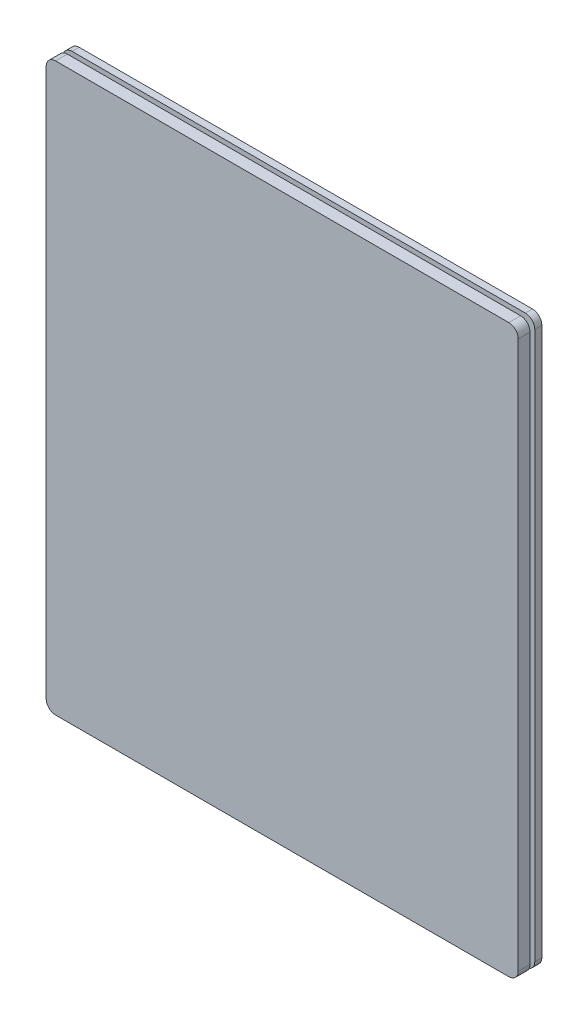
ISO-10303-21;
HEADER;
FILE_DESCRIPTION(('STEP AP214'),'2;1');
FILE_NAME('part.step','',(''),(''),'','','');
FILE_SCHEMA(('AUTOMOTIVE_DESIGN { 1 0 10303 214 1 1 1 1 }'));
ENDSEC;
DATA;
#1=APPLICATION_CONTEXT('core data for automotive mechanical design processes');
#2=APPLICATION_PROTOCOL_DEFINITION('international standard','automotive_design',2000,#1);
#3=PRODUCT_CONTEXT('',#1,'mechanical');
#4=PRODUCT('Part','Part','',(#3));
#5=PRODUCT_RELATED_PRODUCT_CATEGORY('part','',(#4));
#6=PRODUCT_DEFINITION_FORMATION('','',#4);
#7=PRODUCT_DEFINITION_CONTEXT('part definition',#1,'design');
#8=PRODUCT_DEFINITION('design','',#6,#7);
#9=PRODUCT_DEFINITION_SHAPE('','',#8);
#10=(LENGTH_UNIT() NAMED_UNIT(*) SI_UNIT(.MILLI.,.METRE.));
#11=(NAMED_UNIT(*) PLANE_ANGLE_UNIT() SI_UNIT($,.RADIAN.));
#12=(NAMED_UNIT(*) SI_UNIT($,.STERADIAN.) SOLID_ANGLE_UNIT());
#13=UNCERTAINTY_MEASURE_WITH_UNIT(LENGTH_MEASURE(1.E-05),#10,'distance_accuracy_value','');
#14=(GEOMETRIC_REPRESENTATION_CONTEXT(3) GLOBAL_UNCERTAINTY_ASSIGNED_CONTEXT((#13)) GLOBAL_UNIT_ASSIGNED_CONTEXT((#10,
#11,#12)) REPRESENTATION_CONTEXT('',''));
#15=CARTESIAN_POINT('',(0.,0.,0.));
#16=DIRECTION('',(0.,0.,1.));
#17=DIRECTION('',(1.,0.,0.));
#18=AXIS2_PLACEMENT_3D('',#15,#16,#17);
#19=CARTESIAN_POINT('',(-5.08133971291867,6.80382775119617,0.6));
#20=DIRECTION('',(1.,0.,0.));
#21=DIRECTION('',(0.,1.,0.));
#22=AXIS2_PLACEMENT_3D('',#19,#20,#21);
#23=PLANE('',#22);
#24=DIRECTION('',(0.,1.,0.));
#25=VECTOR('',#24,1.);
#26=CARTESIAN_POINT('',(-5.08133971291866,6.80382775119617,0.1));
#27=LINE('',#26,#25);
#28=CARTESIAN_POINT('',(-5.08133971291866,-4.99617224880383,0.1));
#29=VERTEX_POINT('',#28);
#30=CARTESIAN_POINT('',(-5.08133971291866,6.60382775119617,0.1));
#31=VERTEX_POINT('',#30);
#32=EDGE_CURVE('E358',#29,#31,#27,.T.);
#33=ORIENTED_EDGE('',*,*,#32,.F.);
#34=DIRECTION('',(0.,0.,-1.));
#35=VECTOR('',#34,1.);
#36=CARTESIAN_POINT('',(-5.08133971291866,-4.99617224880383,0.6));
#37=LINE('',#36,#35);
#38=CARTESIAN_POINT('',(-5.08133971291867,-4.99617224880383,0.25));
#39=VERTEX_POINT('',#38);
#40=EDGE_CURVE('E390',#29,#39,#37,.F.);
#41=ORIENTED_EDGE('',*,*,#40,.T.);
#42=DIRECTION('',(0.,-1.,0.));
#43=VECTOR('',#42,1.);
#44=CARTESIAN_POINT('',(-5.08133971291867,6.80382775119617,0.25));
#45=LINE('',#44,#43);
#46=CARTESIAN_POINT('',(-5.08133971291867,6.60382775119617,0.25));
#47=VERTEX_POINT('',#46);
#48=EDGE_CURVE('E265',#47,#39,#45,.T.);
#49=ORIENTED_EDGE('',*,*,#48,.F.);
#50=DIRECTION('',(0.,0.,-1.));
#51=VECTOR('',#50,1.);
#52=CARTESIAN_POINT('',(-5.08133971291867,6.60382775119617,0.6));
#53=LINE('',#52,#51);
#54=EDGE_CURVE('E387',#47,#31,#53,.T.);
#55=ORIENTED_EDGE('',*,*,#54,.T.);
#56=EDGE_LOOP('',(#33,#41,#49,#55));
#57=FACE_BOUND('',#56,.T.);
#58=ADVANCED_FACE('F34',(#57),#23,.F.);
#59=CARTESIAN_POINT('',(-5.08133971291866,-5.19617224880383,0.6));
#60=DIRECTION('',(0.,1.,0.));
#61=DIRECTION('',(0.,0.,1.));
#62=AXIS2_PLACEMENT_3D('',#59,#60,#61);
#63=PLANE('',#62);
#64=DIRECTION('',(1.,0.,0.));
#65=VECTOR('',#64,1.);
#66=CARTESIAN_POINT('',(-5.08133971291867,-5.19617224880383,0.25));
#67=LINE('',#66,#65);
#68=CARTESIAN_POINT('',(-4.88133971291866,-5.19617224880383,0.25));
#69=VERTEX_POINT('',#68);
#70=CARTESIAN_POINT('',(4.71866028708134,-5.19617224880383,0.25));
#71=VERTEX_POINT('',#70);
#72=EDGE_CURVE('E268',#69,#71,#67,.T.);
#73=ORIENTED_EDGE('',*,*,#72,.F.);
#74=DIRECTION('',(0.,0.,-1.));
#75=VECTOR('',#74,1.);
#76=CARTESIAN_POINT('',(-4.88133971291866,-5.19617224880383,0.6));
#77=LINE('',#76,#75);
#78=CARTESIAN_POINT('',(-4.88133971291866,-5.19617224880383,0.1));
#79=VERTEX_POINT('',#78);
#80=EDGE_CURVE('E376',#69,#79,#77,.T.);
#81=ORIENTED_EDGE('',*,*,#80,.T.);
#82=DIRECTION('',(-1.,0.,0.));
#83=VECTOR('',#82,1.);
#84=CARTESIAN_POINT('',(4.91866028708133,-5.19617224880383,0.1));
#85=LINE('',#84,#83);
#86=CARTESIAN_POINT('',(4.71866028708134,-5.19617224880383,0.1));
#87=VERTEX_POINT('',#86);
#88=EDGE_CURVE('E355',#87,#79,#85,.T.);
#89=ORIENTED_EDGE('',*,*,#88,.F.);
#90=DIRECTION('',(0.,0.,-1.));
#91=VECTOR('',#90,1.);
#92=CARTESIAN_POINT('',(4.71866028708134,-5.19617224880383,0.6));
#93=LINE('',#92,#91);
#94=EDGE_CURVE('E374',#87,#71,#93,.F.);
#95=ORIENTED_EDGE('',*,*,#94,.T.);
#96=EDGE_LOOP('',(#73,#81,#89,#95));
#97=FACE_BOUND('',#96,.T.);
#98=ADVANCED_FACE('F461',(#97),#63,.F.);
#99=CARTESIAN_POINT('',(4.91866028708133,6.80382775119617,0.6));
#100=DIRECTION('',(-1.,0.,0.));
#101=DIRECTION('',(0.,-1.,0.));
#102=AXIS2_PLACEMENT_3D('',#99,#100,#101);
#103=PLANE('',#102);
#104=DIRECTION('',(0.,1.,0.));
#105=VECTOR('',#104,1.);
#106=CARTESIAN_POINT('',(4.91866028708134,6.80382775119617,0.25));
#107=LINE('',#106,#105);
#108=CARTESIAN_POINT('',(4.91866028708134,-4.99617224880383,0.25));
#109=VERTEX_POINT('',#108);
#110=CARTESIAN_POINT('',(4.91866028708134,6.60382775119617,0.25));
#111=VERTEX_POINT('',#110);
#112=EDGE_CURVE('E272',#109,#111,#107,.T.);
#113=ORIENTED_EDGE('',*,*,#112,.F.);
#114=DIRECTION('',(0.,0.,-1.));
#115=VECTOR('',#114,1.);
#116=CARTESIAN_POINT('',(4.91866028708134,-4.99617224880383,0.6));
#117=LINE('',#116,#115);
#118=CARTESIAN_POINT('',(4.91866028708133,-4.99617224880383,0.1));
#119=VERTEX_POINT('',#118);
#120=EDGE_CURVE('E427',#109,#119,#117,.T.);
#121=ORIENTED_EDGE('',*,*,#120,.T.);
#122=DIRECTION('',(0.,-1.,0.));
#123=VECTOR('',#122,1.);
#124=CARTESIAN_POINT('',(4.91866028708133,6.80382775119617,0.1));
#125=LINE('',#124,#123);
#126=CARTESIAN_POINT('',(4.91866028708133,6.60382775119617,0.1));
#127=VERTEX_POINT('',#126);
#128=EDGE_CURVE('E338',#127,#119,#125,.T.);
#129=ORIENTED_EDGE('',*,*,#128,.F.);
#130=DIRECTION('',(0.,0.,-1.));
#131=VECTOR('',#130,1.);
#132=CARTESIAN_POINT('',(4.91866028708133,6.60382775119617,0.6));
#133=LINE('',#132,#131);
#134=EDGE_CURVE('E425',#127,#111,#133,.F.);
#135=ORIENTED_EDGE('',*,*,#134,.T.);
#136=EDGE_LOOP('',(#113,#121,#129,#135));
#137=FACE_BOUND('',#136,.T.);
#138=ADVANCED_FACE('F470',(#137),#103,.F.);
#139=CARTESIAN_POINT('',(-5.08133971291867,6.80382775119617,0.6));
#140=DIRECTION('',(0.,-1.,0.));
#141=DIRECTION('',(0.,0.,-1.));
#142=AXIS2_PLACEMENT_3D('',#139,#140,#141);
#143=PLANE('',#142);
#144=DIRECTION('',(-1.,0.,0.));
#145=VECTOR('',#144,1.);
#146=CARTESIAN_POINT('',(-5.08133971291867,6.80382775119617,0.25));
#147=LINE('',#146,#145);
#148=CARTESIAN_POINT('',(4.71866028708133,6.80382775119617,0.25));
#149=VERTEX_POINT('',#148);
#150=CARTESIAN_POINT('',(-4.88133971291867,6.80382775119617,0.25));
#151=VERTEX_POINT('',#150);
#152=EDGE_CURVE('E275',#149,#151,#147,.T.);
#153=ORIENTED_EDGE('',*,*,#152,.F.);
#154=DIRECTION('',(0.,0.,-1.));
#155=VECTOR('',#154,1.);
#156=CARTESIAN_POINT('',(4.71866028708133,6.80382775119617,0.6));
#157=LINE('',#156,#155);
#158=CARTESIAN_POINT('',(4.71866028708133,6.80382775119617,0.1));
#159=VERTEX_POINT('',#158);
#160=EDGE_CURVE('E11',#149,#159,#157,.T.);
#161=ORIENTED_EDGE('',*,*,#160,.T.);
#162=DIRECTION('',(1.,0.,0.));
#163=VECTOR('',#162,1.);
#164=CARTESIAN_POINT('',(4.91866028708133,6.80382775119617,0.1));
#165=LINE('',#164,#163);
#166=CARTESIAN_POINT('',(-4.88133971291867,6.80382775119617,0.1));
#167=VERTEX_POINT('',#166);
#168=EDGE_CURVE('E361',#167,#159,#165,.T.);
#169=ORIENTED_EDGE('',*,*,#168,.F.);
#170=DIRECTION('',(0.,0.,-1.));
#171=VECTOR('',#170,1.);
#172=CARTESIAN_POINT('',(-4.88133971291867,6.80382775119617,0.6));
#173=LINE('',#172,#171);
#174=EDGE_CURVE('E42',#167,#151,#173,.F.);
#175=ORIENTED_EDGE('',*,*,#174,.T.);
#176=EDGE_LOOP('',(#153,#161,#169,#175));
#177=FACE_BOUND('',#176,.T.);
#178=ADVANCED_FACE('F442',(#177),#143,.F.);
#179=CARTESIAN_POINT('',(0.,0.,0.1));
#180=DIRECTION('',(0.,0.,-1.));
#181=DIRECTION('',(-1.,0.,0.));
#182=AXIS2_PLACEMENT_3D('',#179,#180,#181);
#183=PLANE('',#182);
#184=DIRECTION('',(0.,1.,0.));
#185=VECTOR('',#184,1.);
#186=CARTESIAN_POINT('',(-3.88404126563209,4.78892639990253,0.1));
#187=LINE('',#186,#185);
#188=CARTESIAN_POINT('',(-3.88404126563209,-3.11592863377221,0.1));
#189=VERTEX_POINT('',#188);
#190=CARTESIAN_POINT('',(-3.88404126563209,4.78892639990253,0.1));
#191=VERTEX_POINT('',#190);
#192=EDGE_CURVE('E310',#189,#191,#187,.T.);
#193=ORIENTED_EDGE('',*,*,#192,.F.);
#194=CARTESIAN_POINT('',(-2.88404126563209,-3.11592863377222,0.1));
#195=DIRECTION('',(0.,0.,-1.));
#196=DIRECTION('',(-1.,0.,0.));
#197=AXIS2_PLACEMENT_3D('',#194,#195,#196);
#198=CIRCLE('',#197,1.);
#199=CARTESIAN_POINT('',(-2.88404126563208,-4.11592863377222,0.1));
#200=VERTEX_POINT('',#199);
#201=EDGE_CURVE('E307',#200,#189,#198,.T.);
#202=ORIENTED_EDGE('',*,*,#201,.F.);
#203=DIRECTION('',(-1.,0.,0.));
#204=VECTOR('',#203,1.);
#205=CARTESIAN_POINT('',(2.71255189932541,-4.11592863377222,0.1));
#206=LINE('',#205,#204);
#207=CARTESIAN_POINT('',(2.71255189932541,-4.11592863377222,0.1));
#208=VERTEX_POINT('',#207);
#209=EDGE_CURVE('E304',#208,#200,#206,.T.);
#210=ORIENTED_EDGE('',*,*,#209,.F.);
#211=CARTESIAN_POINT('',(2.71255189932542,-3.11592863377222,0.1));
#212=DIRECTION('',(0.,0.,-1.));
#213=DIRECTION('',(1.,0.,0.));
#214=AXIS2_PLACEMENT_3D('',#211,#212,#213);
#215=CIRCLE('',#214,1.);
#216=CARTESIAN_POINT('',(3.71255189932542,-3.11592863377222,0.1));
#217=VERTEX_POINT('',#216);
#218=EDGE_CURVE('E301',#217,#208,#215,.T.);
#219=ORIENTED_EDGE('',*,*,#218,.F.);
#220=DIRECTION('',(0.,-1.,0.));
#221=VECTOR('',#220,1.);
#222=CARTESIAN_POINT('',(3.71255189932542,4.78892639990253,0.1));
#223=LINE('',#222,#221);
#224=CARTESIAN_POINT('',(3.71255189932542,4.78892639990253,0.1));
#225=VERTEX_POINT('',#224);
#226=EDGE_CURVE('E298',#225,#217,#223,.T.);
#227=ORIENTED_EDGE('',*,*,#226,.F.);
#228=CARTESIAN_POINT('',(2.71255189932542,4.78892639990254,0.1));
#229=DIRECTION('',(0.,0.,-1.));
#230=DIRECTION('',(-1.,0.,0.));
#231=AXIS2_PLACEMENT_3D('',#228,#229,#230);
#232=CIRCLE('',#231,1.);
#233=CARTESIAN_POINT('',(2.71255189932541,5.78892639990254,0.1));
#234=VERTEX_POINT('',#233);
#235=EDGE_CURVE('E295',#234,#225,#232,.T.);
#236=ORIENTED_EDGE('',*,*,#235,.F.);
#237=DIRECTION('',(1.,0.,0.));
#238=VECTOR('',#237,1.);
#239=CARTESIAN_POINT('',(2.71255189932541,5.78892639990254,0.1));
#240=LINE('',#239,#238);
#241=CARTESIAN_POINT('',(-2.88404126563208,5.78892639990254,0.1));
#242=VERTEX_POINT('',#241);
#243=EDGE_CURVE('E291',#242,#234,#240,.T.);
#244=ORIENTED_EDGE('',*,*,#243,.F.);
#245=CARTESIAN_POINT('',(-2.88404126563209,4.78892639990254,0.1));
#246=DIRECTION('',(0.,0.,-1.));
#247=DIRECTION('',(-1.,0.,0.));
#248=AXIS2_PLACEMENT_3D('',#245,#246,#247);
#249=CIRCLE('',#248,1.);
#250=EDGE_CURVE('E288',#191,#242,#249,.T.);
#251=ORIENTED_EDGE('',*,*,#250,.F.);
#252=EDGE_LOOP('',(#193,#202,#210,#219,#227,#236,#244,#251));
#253=FACE_BOUND('',#252,.T.);
#254=ORIENTED_EDGE('',*,*,#88,.T.);
#255=CARTESIAN_POINT('',(-4.88133971291866,-4.99617224880383,0.1));
#256=DIRECTION('',(0.,0.,-1.));
#257=DIRECTION('',(-1.,0.,0.));
#258=AXIS2_PLACEMENT_3D('',#255,#256,#257);
#259=CIRCLE('',#258,0.2);
#260=EDGE_CURVE('E385',#79,#29,#259,.T.);
#261=ORIENTED_EDGE('',*,*,#260,.T.);
#262=ORIENTED_EDGE('',*,*,#32,.T.);
#263=CARTESIAN_POINT('',(-4.88133971291867,6.60382775119617,0.1));
#264=DIRECTION('',(0.,0.,-1.));
#265=DIRECTION('',(-1.,0.,0.));
#266=AXIS2_PLACEMENT_3D('',#263,#264,#265);
#267=CIRCLE('',#266,0.2);
#268=EDGE_CURVE('E379',#31,#167,#267,.T.);
#269=ORIENTED_EDGE('',*,*,#268,.T.);
#270=ORIENTED_EDGE('',*,*,#168,.T.);
#271=CARTESIAN_POINT('',(4.71866028708133,6.60382775119617,0.1));
#272=DIRECTION('',(0.,0.,-1.));
#273=DIRECTION('',(-1.,0.,0.));
#274=AXIS2_PLACEMENT_3D('',#271,#272,#273);
#275=CIRCLE('',#274,0.2);
#276=EDGE_CURVE('E381',#159,#127,#275,.T.);
#277=ORIENTED_EDGE('',*,*,#276,.T.);
#278=ORIENTED_EDGE('',*,*,#128,.T.);
#279=CARTESIAN_POINT('',(4.71866028708134,-4.99617224880383,0.1));
#280=DIRECTION('',(0.,0.,-1.));
#281=DIRECTION('',(-1.,0.,0.));
#282=AXIS2_PLACEMENT_3D('',#279,#280,#281);
#283=CIRCLE('',#282,0.2);
#284=EDGE_CURVE('E383',#119,#87,#283,.T.);
#285=ORIENTED_EDGE('',*,*,#284,.T.);
#286=EDGE_LOOP('',(#254,#261,#262,#269,#270,#277,#278,#285));
#287=FACE_BOUND('',#286,.T.);
#288=ADVANCED_FACE('F453',(#253,#287),#183,.T.);
#289=CARTESIAN_POINT('',(-2.88404126563209,4.78892639990254,0.1));
#290=DIRECTION('',(0.,0.,-1.));
#291=DIRECTION('',(-1.,0.,0.));
#292=AXIS2_PLACEMENT_3D('',#289,#290,#291);
#293=CYLINDRICAL_SURFACE('',#292,1.);
#294=CARTESIAN_POINT('',(-2.88404126563209,4.78892639990254,0.));
#295=DIRECTION('',(0.,0.,-1.));
#296=DIRECTION('',(-1.,0.,0.));
#297=AXIS2_PLACEMENT_3D('',#294,#295,#296);
#298=CIRCLE('',#297,1.);
#299=CARTESIAN_POINT('',(-3.88404126563209,4.78892639990253,0.));
#300=VERTEX_POINT('',#299);
#301=CARTESIAN_POINT('',(-2.88404126563208,5.78892639990254,0.));
#302=VERTEX_POINT('',#301);
#303=EDGE_CURVE('E278',#300,#302,#298,.T.);
#304=ORIENTED_EDGE('',*,*,#303,.F.);
#305=DIRECTION('',(0.,0.,-1.));
#306=VECTOR('',#305,1.);
#307=CARTESIAN_POINT('',(-3.88404126563209,4.78892639990253,0.1));
#308=LINE('',#307,#306);
#309=EDGE_CURVE('E336',#191,#300,#308,.T.);
#310=ORIENTED_EDGE('',*,*,#309,.F.);
#311=ORIENTED_EDGE('',*,*,#250,.T.);
#312=DIRECTION('',(0.,0.,-1.));
#313=VECTOR('',#312,1.);
#314=CARTESIAN_POINT('',(-2.88404126563208,5.78892639990254,0.1));
#315=LINE('',#314,#313);
#316=EDGE_CURVE('E313',#242,#302,#315,.T.);
#317=ORIENTED_EDGE('',*,*,#316,.T.);
#318=EDGE_LOOP('',(#304,#310,#311,#317));
#319=FACE_BOUND('',#318,.T.);
#320=ADVANCED_FACE('F544',(#319),#293,.T.);
#321=CARTESIAN_POINT('',(-3.88404126563209,4.78892639990253,0.1));
#322=DIRECTION('',(-1.,0.,0.));
#323=DIRECTION('',(0.,0.,1.));
#324=AXIS2_PLACEMENT_3D('',#321,#322,#323);
#325=PLANE('',#324);
#326=DIRECTION('',(0.,1.,0.));
#327=VECTOR('',#326,1.);
#328=CARTESIAN_POINT('',(-3.88404126563209,4.78892639990253,0.));
#329=LINE('',#328,#327);
#330=CARTESIAN_POINT('',(-3.88404126563209,-3.11592863377221,0.));
#331=VERTEX_POINT('',#330);
#332=EDGE_CURVE('E292',#331,#300,#329,.T.);
#333=ORIENTED_EDGE('',*,*,#332,.F.);
#334=DIRECTION('',(0.,0.,-1.));
#335=VECTOR('',#334,1.);
#336=CARTESIAN_POINT('',(-3.88404126563209,-3.11592863377221,0.1));
#337=LINE('',#336,#335);
#338=EDGE_CURVE('E339',#189,#331,#337,.T.);
#339=ORIENTED_EDGE('',*,*,#338,.F.);
#340=ORIENTED_EDGE('',*,*,#192,.T.);
#341=ORIENTED_EDGE('',*,*,#309,.T.);
#342=EDGE_LOOP('',(#333,#339,#340,#341));
#343=FACE_BOUND('',#342,.T.);
#344=ADVANCED_FACE('F540',(#343),#325,.T.);
#345=CARTESIAN_POINT('',(-2.88404126563209,-3.11592863377222,0.1));
#346=DIRECTION('',(0.,0.,-1.));
#347=DIRECTION('',(-1.,0.,0.));
#348=AXIS2_PLACEMENT_3D('',#345,#346,#347);
#349=CYLINDRICAL_SURFACE('',#348,1.);
#350=CARTESIAN_POINT('',(-2.88404126563209,-3.11592863377222,0.));
#351=DIRECTION('',(0.,0.,-1.));
#352=DIRECTION('',(-1.,0.,0.));
#353=AXIS2_PLACEMENT_3D('',#350,#351,#352);
#354=CIRCLE('',#353,1.);
#355=CARTESIAN_POINT('',(-2.88404126563208,-4.11592863377222,0.));
#356=VERTEX_POINT('',#355);
#357=EDGE_CURVE('E331',#356,#331,#354,.T.);
#358=ORIENTED_EDGE('',*,*,#357,.F.);
#359=DIRECTION('',(0.,0.,-1.));
#360=VECTOR('',#359,1.);
#361=CARTESIAN_POINT('',(-2.88404126563208,-4.11592863377222,0.1));
#362=LINE('',#361,#360);
#363=EDGE_CURVE('E341',#200,#356,#362,.T.);
#364=ORIENTED_EDGE('',*,*,#363,.F.);
#365=ORIENTED_EDGE('',*,*,#201,.T.);
#366=ORIENTED_EDGE('',*,*,#338,.T.);
#367=EDGE_LOOP('',(#358,#364,#365,#366));
#368=FACE_BOUND('',#367,.T.);
#369=ADVANCED_FACE('F543',(#368),#349,.T.);
#370=CARTESIAN_POINT('',(2.71255189932541,-4.11592863377222,0.1));
#371=DIRECTION('',(0.,-1.,0.));
#372=DIRECTION('',(0.,0.,-1.));
#373=AXIS2_PLACEMENT_3D('',#370,#371,#372);
#374=PLANE('',#373);
#375=DIRECTION('',(-1.,0.,0.));
#376=VECTOR('',#375,1.);
#377=CARTESIAN_POINT('',(2.71255189932541,-4.11592863377222,0.));
#378=LINE('',#377,#376);
#379=CARTESIAN_POINT('',(2.71255189932541,-4.11592863377222,0.));
#380=VERTEX_POINT('',#379);
#381=EDGE_CURVE('E328',#380,#356,#378,.T.);
#382=ORIENTED_EDGE('',*,*,#381,.F.);
#383=DIRECTION('',(0.,0.,-1.));
#384=VECTOR('',#383,1.);
#385=CARTESIAN_POINT('',(2.71255189932541,-4.11592863377222,0.1));
#386=LINE('',#385,#384);
#387=EDGE_CURVE('E343',#208,#380,#386,.T.);
#388=ORIENTED_EDGE('',*,*,#387,.F.);
#389=ORIENTED_EDGE('',*,*,#209,.T.);
#390=ORIENTED_EDGE('',*,*,#363,.T.);
#391=EDGE_LOOP('',(#382,#388,#389,#390));
#392=FACE_BOUND('',#391,.T.);
#393=ADVANCED_FACE('F548',(#392),#374,.T.);
#394=CARTESIAN_POINT('',(2.71255189932542,-3.11592863377222,0.1));
#395=DIRECTION('',(0.,0.,-1.));
#396=DIRECTION('',(-1.,0.,0.));
#397=AXIS2_PLACEMENT_3D('',#394,#395,#396);
#398=CYLINDRICAL_SURFACE('',#397,1.);
#399=CARTESIAN_POINT('',(2.71255189932542,-3.11592863377222,0.));
#400=DIRECTION('',(0.,0.,-1.));
#401=DIRECTION('',(1.,0.,0.));
#402=AXIS2_PLACEMENT_3D('',#399,#400,#401);
#403=CIRCLE('',#402,1.);
#404=CARTESIAN_POINT('',(3.71255189932542,-3.11592863377222,0.));
#405=VERTEX_POINT('',#404);
#406=EDGE_CURVE('E325',#405,#380,#403,.T.);
#407=ORIENTED_EDGE('',*,*,#406,.F.);
#408=DIRECTION('',(0.,0.,-1.));
#409=VECTOR('',#408,1.);
#410=CARTESIAN_POINT('',(3.71255189932542,-3.11592863377222,0.1));
#411=LINE('',#410,#409);
#412=EDGE_CURVE('E345',#217,#405,#411,.T.);
#413=ORIENTED_EDGE('',*,*,#412,.F.);
#414=ORIENTED_EDGE('',*,*,#218,.T.);
#415=ORIENTED_EDGE('',*,*,#387,.T.);
#416=EDGE_LOOP('',(#407,#413,#414,#415));
#417=FACE_BOUND('',#416,.T.);
#418=ADVANCED_FACE('F552',(#417),#398,.T.);
#419=CARTESIAN_POINT('',(3.71255189932542,4.78892639990253,0.1));
#420=DIRECTION('',(1.,0.,0.));
#421=DIRECTION('',(0.,0.,-1.));
#422=AXIS2_PLACEMENT_3D('',#419,#420,#421);
#423=PLANE('',#422);
#424=DIRECTION('',(0.,-1.,0.));
#425=VECTOR('',#424,1.);
#426=CARTESIAN_POINT('',(3.71255189932542,4.78892639990253,0.));
#427=LINE('',#426,#425);
#428=CARTESIAN_POINT('',(3.71255189932542,4.78892639990253,0.));
#429=VERTEX_POINT('',#428);
#430=EDGE_CURVE('E322',#429,#405,#427,.T.);
#431=ORIENTED_EDGE('',*,*,#430,.F.);
#432=DIRECTION('',(0.,0.,-1.));
#433=VECTOR('',#432,1.);
#434=CARTESIAN_POINT('',(3.71255189932542,4.78892639990253,0.1));
#435=LINE('',#434,#433);
#436=EDGE_CURVE('E347',#225,#429,#435,.T.);
#437=ORIENTED_EDGE('',*,*,#436,.F.);
#438=ORIENTED_EDGE('',*,*,#226,.T.);
#439=ORIENTED_EDGE('',*,*,#412,.T.);
#440=EDGE_LOOP('',(#431,#437,#438,#439));
#441=FACE_BOUND('',#440,.T.);
#442=ADVANCED_FACE('F556',(#441),#423,.T.);
#443=CARTESIAN_POINT('',(2.71255189932542,4.78892639990254,0.1));
#444=DIRECTION('',(0.,0.,-1.));
#445=DIRECTION('',(-1.,0.,0.));
#446=AXIS2_PLACEMENT_3D('',#443,#444,#445);
#447=CYLINDRICAL_SURFACE('',#446,1.);
#448=CARTESIAN_POINT('',(2.71255189932542,4.78892639990254,0.));
#449=DIRECTION('',(0.,0.,-1.));
#450=DIRECTION('',(-1.,0.,0.));
#451=AXIS2_PLACEMENT_3D('',#448,#449,#450);
#452=CIRCLE('',#451,1.);
#453=CARTESIAN_POINT('',(2.71255189932541,5.78892639990254,0.));
#454=VERTEX_POINT('',#453);
#455=EDGE_CURVE('E319',#454,#429,#452,.T.);
#456=ORIENTED_EDGE('',*,*,#455,.F.);
#457=DIRECTION('',(0.,0.,-1.));
#458=VECTOR('',#457,1.);
#459=CARTESIAN_POINT('',(2.71255189932541,5.78892639990254,0.1));
#460=LINE('',#459,#458);
#461=EDGE_CURVE('E349',#234,#454,#460,.T.);
#462=ORIENTED_EDGE('',*,*,#461,.F.);
#463=ORIENTED_EDGE('',*,*,#235,.T.);
#464=ORIENTED_EDGE('',*,*,#436,.T.);
#465=EDGE_LOOP('',(#456,#462,#463,#464));
#466=FACE_BOUND('',#465,.T.);
#467=ADVANCED_FACE('F560',(#466),#447,.T.);
#468=CARTESIAN_POINT('',(2.71255189932541,5.78892639990254,0.1));
#469=DIRECTION('',(0.,1.,0.));
#470=DIRECTION('',(0.,0.,1.));
#471=AXIS2_PLACEMENT_3D('',#468,#469,#470);
#472=PLANE('',#471);
#473=DIRECTION('',(1.,0.,0.));
#474=VECTOR('',#473,1.);
#475=CARTESIAN_POINT('',(2.71255189932541,5.78892639990254,0.));
#476=LINE('',#475,#474);
#477=EDGE_CURVE('E316',#302,#454,#476,.T.);
#478=ORIENTED_EDGE('',*,*,#477,.F.);
#479=ORIENTED_EDGE('',*,*,#316,.F.);
#480=ORIENTED_EDGE('',*,*,#243,.T.);
#481=ORIENTED_EDGE('',*,*,#461,.T.);
#482=EDGE_LOOP('',(#478,#479,#480,#481));
#483=FACE_BOUND('',#482,.T.);
#484=ADVANCED_FACE('F564',(#483),#472,.T.);
#485=CARTESIAN_POINT('',(0.,0.,0.));
#486=DIRECTION('',(0.,0.,1.));
#487=DIRECTION('',(1.,0.,0.));
#488=AXIS2_PLACEMENT_3D('',#485,#486,#487);
#489=PLANE('',#488);
#490=ORIENTED_EDGE('',*,*,#303,.T.);
#491=ORIENTED_EDGE('',*,*,#477,.T.);
#492=ORIENTED_EDGE('',*,*,#455,.T.);
#493=ORIENTED_EDGE('',*,*,#430,.T.);
#494=ORIENTED_EDGE('',*,*,#406,.T.);
#495=ORIENTED_EDGE('',*,*,#381,.T.);
#496=ORIENTED_EDGE('',*,*,#357,.T.);
#497=ORIENTED_EDGE('',*,*,#332,.T.);
#498=EDGE_LOOP('',(#490,#491,#492,#493,#494,#495,#496,#497));
#499=FACE_BOUND('',#498,.T.);
#500=ADVANCED_FACE('F537',(#499),#489,.F.);
#501=CARTESIAN_POINT('',(0.,0.,0.25));
#502=DIRECTION('',(0.,0.,1.));
#503=DIRECTION('',(1.,0.,0.));
#504=AXIS2_PLACEMENT_3D('',#501,#502,#503);
#505=PLANE('',#504);
#506=DIRECTION('',(0.646267289690569,0.763111125771343,0.));
#507=VECTOR('',#506,1.);
#508=CARTESIAN_POINT('',(0.,-0.374397757809675,0.25));
#509=LINE('',#508,#507);
#510=CARTESIAN_POINT('',(0.,-0.374397757809675,0.25));
#511=VERTEX_POINT('',#510);
#512=CARTESIAN_POINT('',(0.997821392762209,0.80382775119617,0.25));
#513=VERTEX_POINT('',#512);
#514=EDGE_CURVE('E232',#511,#513,#509,.T.);
#515=ORIENTED_EDGE('',*,*,#514,.F.);
#516=DIRECTION('',(0.610983232927453,-0.791643536625872,0.));
#517=VECTOR('',#516,1.);
#518=CARTESIAN_POINT('',(-0.9093436594938,0.80382775119617,0.25));
#519=LINE('',#518,#517);
#520=CARTESIAN_POINT('',(-0.9093436594938,0.80382775119617,0.25));
#521=VERTEX_POINT('',#520);
#522=EDGE_CURVE('E242',#521,#511,#519,.T.);
#523=ORIENTED_EDGE('',*,*,#522,.F.);
#524=DIRECTION('',(-0.646267289690569,-0.763111125771343,0.));
#525=VECTOR('',#524,1.);
#526=CARTESIAN_POINT('',(0.,1.87757892935281,0.25));
#527=LINE('',#526,#525);
#528=CARTESIAN_POINT('',(0.,1.87757892935281,0.25));
#529=VERTEX_POINT('',#528);
#530=EDGE_CURVE('E225',#529,#521,#527,.T.);
#531=ORIENTED_EDGE('',*,*,#530,.F.);
#532=DIRECTION('',(-0.680731933680003,0.732532616658319,0.));
#533=VECTOR('',#532,1.);
#534=CARTESIAN_POINT('',(0.997821392762209,0.80382775119617,0.25));
#535=LINE('',#534,#533);
#536=EDGE_CURVE('E239',#513,#529,#535,.T.);
#537=ORIENTED_EDGE('',*,*,#536,.F.);
#538=EDGE_LOOP('',(#515,#523,#531,#537));
#539=FACE_BOUND('',#538,.T.);
#540=ORIENTED_EDGE('',*,*,#48,.T.);
#541=CARTESIAN_POINT('',(-4.88133971291866,-4.99617224880383,0.25));
#542=DIRECTION('',(0.,0.,1.));
#543=DIRECTION('',(1.,0.,0.));
#544=AXIS2_PLACEMENT_3D('',#541,#542,#543);
#545=CIRCLE('',#544,0.2);
#546=EDGE_CURVE('E398',#39,#69,#545,.T.);
#547=ORIENTED_EDGE('',*,*,#546,.T.);
#548=ORIENTED_EDGE('',*,*,#72,.T.);
#549=CARTESIAN_POINT('',(4.71866028708134,-4.99617224880383,0.25));
#550=DIRECTION('',(0.,0.,1.));
#551=DIRECTION('',(1.,0.,0.));
#552=AXIS2_PLACEMENT_3D('',#549,#550,#551);
#553=CIRCLE('',#552,0.2);
#554=EDGE_CURVE('E396',#71,#109,#553,.T.);
#555=ORIENTED_EDGE('',*,*,#554,.T.);
#556=ORIENTED_EDGE('',*,*,#112,.T.);
#557=CARTESIAN_POINT('',(4.71866028708133,6.60382775119617,0.25));
#558=DIRECTION('',(0.,0.,1.));
#559=DIRECTION('',(1.,0.,0.));
#560=AXIS2_PLACEMENT_3D('',#557,#558,#559);
#561=CIRCLE('',#560,0.2);
#562=EDGE_CURVE('E394',#111,#149,#561,.T.);
#563=ORIENTED_EDGE('',*,*,#562,.T.);
#564=ORIENTED_EDGE('',*,*,#152,.T.);
#565=CARTESIAN_POINT('',(-4.88133971291867,6.60382775119617,0.25));
#566=DIRECTION('',(0.,0.,1.));
#567=DIRECTION('',(1.,0.,0.));
#568=AXIS2_PLACEMENT_3D('',#565,#566,#567);
#569=CIRCLE('',#568,0.2);
#570=EDGE_CURVE('E392',#151,#47,#569,.T.);
#571=ORIENTED_EDGE('',*,*,#570,.T.);
#572=EDGE_LOOP('',(#540,#547,#548,#555,#556,#563,#564,#571));
#573=FACE_BOUND('',#572,.T.);
#574=ADVANCED_FACE('F237',(#539,#573),#505,.T.);
#575=CARTESIAN_POINT('',(0.,0.,0.35));
#576=DIRECTION('',(0.,0.,1.));
#577=DIRECTION('',(1.,0.,0.));
#578=AXIS2_PLACEMENT_3D('',#575,#576,#577);
#579=PLANE('',#578);
#580=DIRECTION('',(-0.680731933680003,0.732532616658319,0.));
#581=VECTOR('',#580,1.);
#582=CARTESIAN_POINT('',(0.997821392762209,0.80382775119617,0.35));
#583=LINE('',#582,#581);
#584=CARTESIAN_POINT('',(0.997821392762209,0.80382775119617,0.35));
#585=VERTEX_POINT('',#584);
#586=CARTESIAN_POINT('',(0.,1.87757892935281,0.35));
#587=VERTEX_POINT('',#586);
#588=EDGE_CURVE('E255',#585,#587,#583,.T.);
#589=ORIENTED_EDGE('',*,*,#588,.T.);
#590=DIRECTION('',(-0.646267289690569,-0.763111125771343,0.));
#591=VECTOR('',#590,1.);
#592=CARTESIAN_POINT('',(0.,1.87757892935281,0.35));
#593=LINE('',#592,#591);
#594=CARTESIAN_POINT('',(-0.9093436594938,0.80382775119617,0.35));
#595=VERTEX_POINT('',#594);
#596=EDGE_CURVE('E227',#587,#595,#593,.T.);
#597=ORIENTED_EDGE('',*,*,#596,.T.);
#598=DIRECTION('',(0.610983232927453,-0.791643536625872,0.));
#599=VECTOR('',#598,1.);
#600=CARTESIAN_POINT('',(-0.9093436594938,0.80382775119617,0.35));
#601=LINE('',#600,#599);
#602=CARTESIAN_POINT('',(0.,-0.374397757809675,0.35));
#603=VERTEX_POINT('',#602);
#604=EDGE_CURVE('E250',#595,#603,#601,.T.);
#605=ORIENTED_EDGE('',*,*,#604,.T.);
#606=DIRECTION('',(0.646267289690569,0.763111125771343,0.));
#607=VECTOR('',#606,1.);
#608=CARTESIAN_POINT('',(0.,-0.374397757809675,0.35));
#609=LINE('',#608,#607);
#610=EDGE_CURVE('E247',#603,#585,#609,.T.);
#611=ORIENTED_EDGE('',*,*,#610,.T.);
#612=EDGE_LOOP('',(#589,#597,#605,#611));
#613=FACE_BOUND('',#612,.T.);
#614=DIRECTION('',(1.,0.,0.));
#615=VECTOR('',#614,1.);
#616=CARTESIAN_POINT('',(-5.08133971291867,-5.19617224880383,0.35));
#617=LINE('',#616,#615);
#618=CARTESIAN_POINT('',(-4.88133971291866,-5.19617224880383,0.35));
#619=VERTEX_POINT('',#618);
#620=CARTESIAN_POINT('',(4.71866028708134,-5.19617224880383,0.35));
#621=VERTEX_POINT('',#620);
#622=EDGE_CURVE('E281',#619,#621,#617,.T.);
#623=ORIENTED_EDGE('',*,*,#622,.F.);
#624=CARTESIAN_POINT('',(-4.88133971291866,-4.99617224880383,0.35));
#625=DIRECTION('',(0.,0.,1.));
#626=DIRECTION('',(1.,0.,0.));
#627=AXIS2_PLACEMENT_3D('',#624,#625,#626);
#628=CIRCLE('',#627,0.2);
#629=CARTESIAN_POINT('',(-5.08133971291867,-4.99617224880383,0.35));
#630=VERTEX_POINT('',#629);
#631=EDGE_CURVE('E411',#619,#630,#628,.F.);
#632=ORIENTED_EDGE('',*,*,#631,.T.);
#633=DIRECTION('',(0.,-1.,0.));
#634=VECTOR('',#633,1.);
#635=CARTESIAN_POINT('',(-5.08133971291867,6.80382775119617,0.35));
#636=LINE('',#635,#634);
#637=CARTESIAN_POINT('',(-5.08133971291867,6.60382775119617,0.35));
#638=VERTEX_POINT('',#637);
#639=EDGE_CURVE('E261',#638,#630,#636,.T.);
#640=ORIENTED_EDGE('',*,*,#639,.F.);
#641=CARTESIAN_POINT('',(-4.88133971291867,6.60382775119617,0.35));
#642=DIRECTION('',(0.,0.,1.));
#643=DIRECTION('',(1.,0.,0.));
#644=AXIS2_PLACEMENT_3D('',#641,#642,#643);
#645=CIRCLE('',#644,0.2);
#646=CARTESIAN_POINT('',(-4.88133971291867,6.80382775119617,0.35));
#647=VERTEX_POINT('',#646);
#648=EDGE_CURVE('E405',#638,#647,#645,.F.);
#649=ORIENTED_EDGE('',*,*,#648,.T.);
#650=DIRECTION('',(-1.,0.,0.));
#651=VECTOR('',#650,1.);
#652=CARTESIAN_POINT('',(-5.08133971291867,6.80382775119617,0.35));
#653=LINE('',#652,#651);
#654=CARTESIAN_POINT('',(4.71866028708133,6.80382775119617,0.35));
#655=VERTEX_POINT('',#654);
#656=EDGE_CURVE('E269',#655,#647,#653,.T.);
#657=ORIENTED_EDGE('',*,*,#656,.F.);
#658=CARTESIAN_POINT('',(4.71866028708133,6.60382775119617,0.35));
#659=DIRECTION('',(0.,0.,1.));
#660=DIRECTION('',(1.,0.,0.));
#661=AXIS2_PLACEMENT_3D('',#658,#659,#660);
#662=CIRCLE('',#661,0.2);
#663=CARTESIAN_POINT('',(4.91866028708134,6.60382775119617,0.35));
#664=VERTEX_POINT('',#663);
#665=EDGE_CURVE('E407',#655,#664,#662,.F.);
#666=ORIENTED_EDGE('',*,*,#665,.T.);
#667=DIRECTION('',(0.,1.,0.));
#668=VECTOR('',#667,1.);
#669=CARTESIAN_POINT('',(4.91866028708134,6.80382775119617,0.35));
#670=LINE('',#669,#668);
#671=CARTESIAN_POINT('',(4.91866028708134,-4.99617224880383,0.35));
#672=VERTEX_POINT('',#671);
#673=EDGE_CURVE('E284',#672,#664,#670,.T.);
#674=ORIENTED_EDGE('',*,*,#673,.F.);
#675=CARTESIAN_POINT('',(4.71866028708134,-4.99617224880383,0.35));
#676=DIRECTION('',(0.,0.,1.));
#677=DIRECTION('',(1.,0.,0.));
#678=AXIS2_PLACEMENT_3D('',#675,#676,#677);
#679=CIRCLE('',#678,0.2);
#680=EDGE_CURVE('E409',#672,#621,#679,.F.);
#681=ORIENTED_EDGE('',*,*,#680,.T.);
#682=EDGE_LOOP('',(#623,#632,#640,#649,#657,#666,#674,#681));
#683=FACE_BOUND('',#682,.T.);
#684=ADVANCED_FACE('F526',(#613,#683),#579,.F.);
#685=CARTESIAN_POINT('',(0.997821392762209,0.80382775119617,0.25));
#686=DIRECTION('',(0.732532616658319,0.680731933680003,0.));
#687=DIRECTION('',(-0.680731933680003,0.732532616658319,0.));
#688=AXIS2_PLACEMENT_3D('',#685,#686,#687);
#689=PLANE('',#688);
#690=ORIENTED_EDGE('',*,*,#588,.F.);
#691=DIRECTION('',(0.,0.,1.));
#692=VECTOR('',#691,1.);
#693=CARTESIAN_POINT('',(0.997821392762209,0.80382775119617,0.25));
#694=LINE('',#693,#692);
#695=EDGE_CURVE('E246',#513,#585,#694,.T.);
#696=ORIENTED_EDGE('',*,*,#695,.F.);
#697=ORIENTED_EDGE('',*,*,#536,.T.);
#698=DIRECTION('',(0.,0.,1.));
#699=VECTOR('',#698,1.);
#700=CARTESIAN_POINT('',(0.,1.87757892935281,0.25));
#701=LINE('',#700,#699);
#702=EDGE_CURVE('E222',#529,#587,#701,.T.);
#703=ORIENTED_EDGE('',*,*,#702,.T.);
#704=EDGE_LOOP('',(#690,#696,#697,#703));
#705=FACE_BOUND('',#704,.T.);
#706=ADVANCED_FACE('F245',(#705),#689,.T.);
#707=CARTESIAN_POINT('',(0.,-0.374397757809675,0.25));
#708=DIRECTION('',(0.763111125771343,-0.646267289690569,0.));
#709=DIRECTION('',(0.646267289690569,0.763111125771343,0.));
#710=AXIS2_PLACEMENT_3D('',#707,#708,#709);
#711=PLANE('',#710);
#712=ORIENTED_EDGE('',*,*,#610,.F.);
#713=DIRECTION('',(0.,0.,1.));
#714=VECTOR('',#713,1.);
#715=CARTESIAN_POINT('',(0.,-0.374397757809675,0.25));
#716=LINE('',#715,#714);
#717=EDGE_CURVE('E262',#511,#603,#716,.T.);
#718=ORIENTED_EDGE('',*,*,#717,.F.);
#719=ORIENTED_EDGE('',*,*,#514,.T.);
#720=ORIENTED_EDGE('',*,*,#695,.T.);
#721=EDGE_LOOP('',(#712,#718,#719,#720));
#722=FACE_BOUND('',#721,.T.);
#723=ADVANCED_FACE('F535',(#722),#711,.T.);
#724=CARTESIAN_POINT('',(-0.9093436594938,0.80382775119617,0.25));
#725=DIRECTION('',(-0.791643536625872,-0.610983232927453,0.));
#726=DIRECTION('',(0.610983232927453,-0.791643536625872,0.));
#727=AXIS2_PLACEMENT_3D('',#724,#725,#726);
#728=PLANE('',#727);
#729=ORIENTED_EDGE('',*,*,#604,.F.);
#730=DIRECTION('',(0.,0.,1.));
#731=VECTOR('',#730,1.);
#732=CARTESIAN_POINT('',(-0.9093436594938,0.80382775119617,0.25));
#733=LINE('',#732,#731);
#734=EDGE_CURVE('E231',#521,#595,#733,.T.);
#735=ORIENTED_EDGE('',*,*,#734,.F.);
#736=ORIENTED_EDGE('',*,*,#522,.T.);
#737=ORIENTED_EDGE('',*,*,#717,.T.);
#738=EDGE_LOOP('',(#729,#735,#736,#737));
#739=FACE_BOUND('',#738,.T.);
#740=ADVANCED_FACE('F731',(#739),#728,.T.);
#741=CARTESIAN_POINT('',(0.,1.87757892935281,0.25));
#742=DIRECTION('',(-0.763111125771343,0.646267289690569,0.));
#743=DIRECTION('',(-0.646267289690569,-0.763111125771343,0.));
#744=AXIS2_PLACEMENT_3D('',#741,#742,#743);
#745=PLANE('',#744);
#746=ORIENTED_EDGE('',*,*,#596,.F.);
#747=ORIENTED_EDGE('',*,*,#702,.F.);
#748=ORIENTED_EDGE('',*,*,#530,.T.);
#749=ORIENTED_EDGE('',*,*,#734,.T.);
#750=EDGE_LOOP('',(#746,#747,#748,#749));
#751=FACE_BOUND('',#750,.T.);
#752=ADVANCED_FACE('F224',(#751),#745,.T.);
#753=CARTESIAN_POINT('',(0.,0.,0.6));
#754=DIRECTION('',(0.,0.,1.));
#755=DIRECTION('',(1.,0.,0.));
#756=AXIS2_PLACEMENT_3D('',#753,#754,#755);
#757=PLANE('',#756);
#758=DIRECTION('',(0.,-1.,0.));
#759=VECTOR('',#758,1.);
#760=CARTESIAN_POINT('',(-5.08133971291867,6.80382775119617,0.6));
#761=LINE('',#760,#759);
#762=CARTESIAN_POINT('',(-5.08133971291867,6.60382775119617,0.6));
#763=VERTEX_POINT('',#762);
#764=CARTESIAN_POINT('',(-5.08133971291866,-4.99617224880383,0.6));
#765=VERTEX_POINT('',#764);
#766=EDGE_CURVE('E364',#763,#765,#761,.T.);
#767=ORIENTED_EDGE('',*,*,#766,.T.);
#768=CARTESIAN_POINT('',(-4.88133971291866,-4.99617224880383,0.6));
#769=DIRECTION('',(0.,0.,1.));
#770=DIRECTION('',(1.,0.,0.));
#771=AXIS2_PLACEMENT_3D('',#768,#769,#770);
#772=CIRCLE('',#771,0.2);
#773=CARTESIAN_POINT('',(-4.88133971291866,-5.19617224880383,0.6));
#774=VERTEX_POINT('',#773);
#775=EDGE_CURVE('E423',#765,#774,#772,.T.);
#776=ORIENTED_EDGE('',*,*,#775,.T.);
#777=DIRECTION('',(1.,0.,0.));
#778=VECTOR('',#777,1.);
#779=CARTESIAN_POINT('',(-5.08133971291866,-5.19617224880383,0.6));
#780=LINE('',#779,#778);
#781=CARTESIAN_POINT('',(4.71866028708134,-5.19617224880383,0.6));
#782=VERTEX_POINT('',#781);
#783=EDGE_CURVE('E367',#774,#782,#780,.T.);
#784=ORIENTED_EDGE('',*,*,#783,.T.);
#785=CARTESIAN_POINT('',(4.71866028708134,-4.99617224880383,0.6));
#786=DIRECTION('',(0.,0.,1.));
#787=DIRECTION('',(1.,0.,0.));
#788=AXIS2_PLACEMENT_3D('',#785,#786,#787);
#789=CIRCLE('',#788,0.2);
#790=CARTESIAN_POINT('',(4.91866028708134,-4.99617224880383,0.6));
#791=VERTEX_POINT('',#790);
#792=EDGE_CURVE('E421',#782,#791,#789,.T.);
#793=ORIENTED_EDGE('',*,*,#792,.T.);
#794=DIRECTION('',(0.,1.,0.));
#795=VECTOR('',#794,1.);
#796=CARTESIAN_POINT('',(4.91866028708133,6.80382775119617,0.6));
#797=LINE('',#796,#795);
#798=CARTESIAN_POINT('',(4.91866028708133,6.60382775119617,0.6));
#799=VERTEX_POINT('',#798);
#800=EDGE_CURVE('E370',#791,#799,#797,.T.);
#801=ORIENTED_EDGE('',*,*,#800,.T.);
#802=CARTESIAN_POINT('',(4.71866028708133,6.60382775119617,0.6));
#803=DIRECTION('',(0.,0.,1.));
#804=DIRECTION('',(1.,0.,0.));
#805=AXIS2_PLACEMENT_3D('',#802,#803,#804);
#806=CIRCLE('',#805,0.2);
#807=CARTESIAN_POINT('',(4.71866028708133,6.80382775119617,0.6));
#808=VERTEX_POINT('',#807);
#809=EDGE_CURVE('E56',#799,#808,#806,.T.);
#810=ORIENTED_EDGE('',*,*,#809,.T.);
#811=DIRECTION('',(-1.,0.,0.));
#812=VECTOR('',#811,1.);
#813=CARTESIAN_POINT('',(-5.08133971291867,6.80382775119617,0.6));
#814=LINE('',#813,#812);
#815=CARTESIAN_POINT('',(-4.88133971291867,6.80382775119617,0.6));
#816=VERTEX_POINT('',#815);
#817=EDGE_CURVE('E372',#808,#816,#814,.T.);
#818=ORIENTED_EDGE('',*,*,#817,.T.);
#819=CARTESIAN_POINT('',(-4.88133971291867,6.60382775119617,0.6));
#820=DIRECTION('',(0.,0.,1.));
#821=DIRECTION('',(1.,0.,0.));
#822=AXIS2_PLACEMENT_3D('',#819,#820,#821);
#823=CIRCLE('',#822,0.2);
#824=EDGE_CURVE('E418',#816,#763,#823,.T.);
#825=ORIENTED_EDGE('',*,*,#824,.T.);
#826=EDGE_LOOP('',(#767,#776,#784,#793,#801,#810,#818,#825));
#827=FACE_BOUND('',#826,.T.);
#828=ADVANCED_FACE('F513',(#827),#757,.T.);
#829=ORIENTED_EDGE('',*,*,#817,.F.);
#830=DIRECTION('',(0.,0.,-1.));
#831=VECTOR('',#830,1.);
#832=CARTESIAN_POINT('',(4.71866028708133,6.80382775119617,0.6));
#833=LINE('',#832,#831);
#834=EDGE_CURVE('E436',#808,#655,#833,.T.);
#835=ORIENTED_EDGE('',*,*,#834,.T.);
#836=ORIENTED_EDGE('',*,*,#656,.T.);
#837=DIRECTION('',(0.,0.,-1.));
#838=VECTOR('',#837,1.);
#839=CARTESIAN_POINT('',(-4.88133971291867,6.80382775119617,0.6));
#840=LINE('',#839,#838);
#841=EDGE_CURVE('E49',#647,#816,#840,.F.);
#842=ORIENTED_EDGE('',*,*,#841,.T.);
#843=EDGE_LOOP('',(#829,#835,#836,#842));
#844=FACE_BOUND('',#843,.T.);
#845=ADVANCED_FACE('F525',(#844),#143,.F.);
#846=ORIENTED_EDGE('',*,*,#800,.F.);
#847=DIRECTION('',(0.,0.,-1.));
#848=VECTOR('',#847,1.);
#849=CARTESIAN_POINT('',(4.91866028708134,-4.99617224880383,0.6));
#850=LINE('',#849,#848);
#851=EDGE_CURVE('E432',#791,#672,#850,.T.);
#852=ORIENTED_EDGE('',*,*,#851,.T.);
#853=ORIENTED_EDGE('',*,*,#673,.T.);
#854=DIRECTION('',(0.,0.,-1.));
#855=VECTOR('',#854,1.);
#856=CARTESIAN_POINT('',(4.91866028708133,6.60382775119617,0.6));
#857=LINE('',#856,#855);
#858=EDGE_CURVE('E430',#664,#799,#857,.F.);
#859=ORIENTED_EDGE('',*,*,#858,.T.);
#860=EDGE_LOOP('',(#846,#852,#853,#859));
#861=FACE_BOUND('',#860,.T.);
#862=ADVANCED_FACE('F502',(#861),#103,.F.);
#863=ORIENTED_EDGE('',*,*,#783,.F.);
#864=DIRECTION('',(0.,0.,-1.));
#865=VECTOR('',#864,1.);
#866=CARTESIAN_POINT('',(-4.88133971291866,-5.19617224880383,0.6));
#867=LINE('',#866,#865);
#868=EDGE_CURVE('E402',#774,#619,#867,.T.);
#869=ORIENTED_EDGE('',*,*,#868,.T.);
#870=ORIENTED_EDGE('',*,*,#622,.T.);
#871=DIRECTION('',(0.,0.,-1.));
#872=VECTOR('',#871,1.);
#873=CARTESIAN_POINT('',(4.71866028708134,-5.19617224880383,0.6));
#874=LINE('',#873,#872);
#875=EDGE_CURVE('E400',#621,#782,#874,.F.);
#876=ORIENTED_EDGE('',*,*,#875,.T.);
#877=EDGE_LOOP('',(#863,#869,#870,#876));
#878=FACE_BOUND('',#877,.T.);
#879=ADVANCED_FACE('F493',(#878),#63,.F.);
#880=ORIENTED_EDGE('',*,*,#639,.T.);
#881=DIRECTION('',(0.,0.,-1.));
#882=VECTOR('',#881,1.);
#883=CARTESIAN_POINT('',(-5.08133971291866,-4.99617224880383,0.6));
#884=LINE('',#883,#882);
#885=EDGE_CURVE('E416',#630,#765,#884,.F.);
#886=ORIENTED_EDGE('',*,*,#885,.T.);
#887=ORIENTED_EDGE('',*,*,#766,.F.);
#888=DIRECTION('',(0.,0.,-1.));
#889=VECTOR('',#888,1.);
#890=CARTESIAN_POINT('',(-5.08133971291867,6.60382775119617,0.6));
#891=LINE('',#890,#889);
#892=EDGE_CURVE('E413',#763,#638,#891,.T.);
#893=ORIENTED_EDGE('',*,*,#892,.T.);
#894=EDGE_LOOP('',(#880,#886,#887,#893));
#895=FACE_BOUND('',#894,.T.);
#896=ADVANCED_FACE('F488',(#895),#23,.F.);
#897=CARTESIAN_POINT('',(-4.88133971291866,-4.99617224880383,0.6));
#898=DIRECTION('',(0.,0.,-1.));
#899=DIRECTION('',(-1.,0.,0.));
#900=AXIS2_PLACEMENT_3D('',#897,#898,#899);
#901=CYLINDRICAL_SURFACE('',#900,0.2);
#902=ORIENTED_EDGE('',*,*,#546,.F.);
#903=ORIENTED_EDGE('',*,*,#40,.F.);
#904=ORIENTED_EDGE('',*,*,#260,.F.);
#905=ORIENTED_EDGE('',*,*,#80,.F.);
#906=EDGE_LOOP('',(#902,#903,#904,#905));
#907=FACE_BOUND('',#906,.T.);
#908=ADVANCED_FACE('F458',(#907),#901,.T.);
#909=CARTESIAN_POINT('',(-4.88133971291866,-4.99617224880383,0.6));
#910=DIRECTION('',(0.,0.,-1.));
#911=DIRECTION('',(-1.,0.,0.));
#912=AXIS2_PLACEMENT_3D('',#909,#910,#911);
#913=CYLINDRICAL_SURFACE('',#912,0.2);
#914=ORIENTED_EDGE('',*,*,#775,.F.);
#915=ORIENTED_EDGE('',*,*,#885,.F.);
#916=ORIENTED_EDGE('',*,*,#631,.F.);
#917=ORIENTED_EDGE('',*,*,#868,.F.);
#918=EDGE_LOOP('',(#914,#915,#916,#917));
#919=FACE_BOUND('',#918,.T.);
#920=ADVANCED_FACE('F501',(#919),#913,.T.);
#921=CARTESIAN_POINT('',(4.71866028708134,-4.99617224880383,0.6));
#922=DIRECTION('',(0.,0.,-1.));
#923=DIRECTION('',(-1.,0.,0.));
#924=AXIS2_PLACEMENT_3D('',#921,#922,#923);
#925=CYLINDRICAL_SURFACE('',#924,0.2);
#926=ORIENTED_EDGE('',*,*,#554,.F.);
#927=ORIENTED_EDGE('',*,*,#94,.F.);
#928=ORIENTED_EDGE('',*,*,#284,.F.);
#929=ORIENTED_EDGE('',*,*,#120,.F.);
#930=EDGE_LOOP('',(#926,#927,#928,#929));
#931=FACE_BOUND('',#930,.T.);
#932=ADVANCED_FACE('F467',(#931),#925,.T.);
#933=CARTESIAN_POINT('',(4.71866028708134,-4.99617224880383,0.6));
#934=DIRECTION('',(0.,0.,-1.));
#935=DIRECTION('',(-1.,0.,0.));
#936=AXIS2_PLACEMENT_3D('',#933,#934,#935);
#937=CYLINDRICAL_SURFACE('',#936,0.2);
#938=ORIENTED_EDGE('',*,*,#792,.F.);
#939=ORIENTED_EDGE('',*,*,#875,.F.);
#940=ORIENTED_EDGE('',*,*,#680,.F.);
#941=ORIENTED_EDGE('',*,*,#851,.F.);
#942=EDGE_LOOP('',(#938,#939,#940,#941));
#943=FACE_BOUND('',#942,.T.);
#944=ADVANCED_FACE('F483',(#943),#937,.T.);
#945=CARTESIAN_POINT('',(4.71866028708133,6.60382775119617,0.6));
#946=DIRECTION('',(0.,0.,-1.));
#947=DIRECTION('',(-1.,0.,0.));
#948=AXIS2_PLACEMENT_3D('',#945,#946,#947);
#949=CYLINDRICAL_SURFACE('',#948,0.2);
#950=ORIENTED_EDGE('',*,*,#809,.F.);
#951=ORIENTED_EDGE('',*,*,#858,.F.);
#952=ORIENTED_EDGE('',*,*,#665,.F.);
#953=ORIENTED_EDGE('',*,*,#834,.F.);
#954=EDGE_LOOP('',(#950,#951,#952,#953));
#955=FACE_BOUND('',#954,.T.);
#956=ADVANCED_FACE('F476',(#955),#949,.T.);
#957=CARTESIAN_POINT('',(4.71866028708133,6.60382775119617,0.6));
#958=DIRECTION('',(0.,0.,-1.));
#959=DIRECTION('',(-1.,0.,0.));
#960=AXIS2_PLACEMENT_3D('',#957,#958,#959);
#961=CYLINDRICAL_SURFACE('',#960,0.2);
#962=ORIENTED_EDGE('',*,*,#562,.F.);
#963=ORIENTED_EDGE('',*,*,#134,.F.);
#964=ORIENTED_EDGE('',*,*,#276,.F.);
#965=ORIENTED_EDGE('',*,*,#160,.F.);
#966=EDGE_LOOP('',(#962,#963,#964,#965));
#967=FACE_BOUND('',#966,.T.);
#968=ADVANCED_FACE('F473',(#967),#961,.T.);
#969=CARTESIAN_POINT('',(-4.88133971291867,6.60382775119617,0.6));
#970=DIRECTION('',(0.,0.,-1.));
#971=DIRECTION('',(-1.,0.,0.));
#972=AXIS2_PLACEMENT_3D('',#969,#970,#971);
#973=CYLINDRICAL_SURFACE('',#972,0.2);
#974=ORIENTED_EDGE('',*,*,#824,.F.);
#975=ORIENTED_EDGE('',*,*,#841,.F.);
#976=ORIENTED_EDGE('',*,*,#648,.F.);
#977=ORIENTED_EDGE('',*,*,#892,.F.);
#978=EDGE_LOOP('',(#974,#975,#976,#977));
#979=FACE_BOUND('',#978,.T.);
#980=ADVANCED_FACE('F475',(#979),#973,.T.);
#981=CARTESIAN_POINT('',(-4.88133971291867,6.60382775119617,0.6));
#982=DIRECTION('',(0.,0.,-1.));
#983=DIRECTION('',(-1.,0.,0.));
#984=AXIS2_PLACEMENT_3D('',#981,#982,#983);
#985=CYLINDRICAL_SURFACE('',#984,0.2);
#986=ORIENTED_EDGE('',*,*,#570,.F.);
#987=ORIENTED_EDGE('',*,*,#174,.F.);
#988=ORIENTED_EDGE('',*,*,#268,.F.);
#989=ORIENTED_EDGE('',*,*,#54,.F.);
#990=EDGE_LOOP('',(#986,#987,#988,#989));
#991=FACE_BOUND('',#990,.T.);
#992=ADVANCED_FACE('F36',(#991),#985,.T.);
#993=CLOSED_SHELL('',(#58,#98,#138,#178,#288,#320,#344,#369,#393,#418,#442,#467,#484,#500,#574,
#684,#706,#723,#740,#752,#828,#845,#862,#879,#896,#908,#920,#932,#944,#956,#968,#980,#992));
#994=MANIFOLD_SOLID_BREP('B2',#993);
#995=ADVANCED_BREP_SHAPE_REPRESENTATION('',(#18,#994),#14);
#996=SHAPE_DEFINITION_REPRESENTATION(#9,#995);
ENDSEC;
END-ISO-10303-21;
